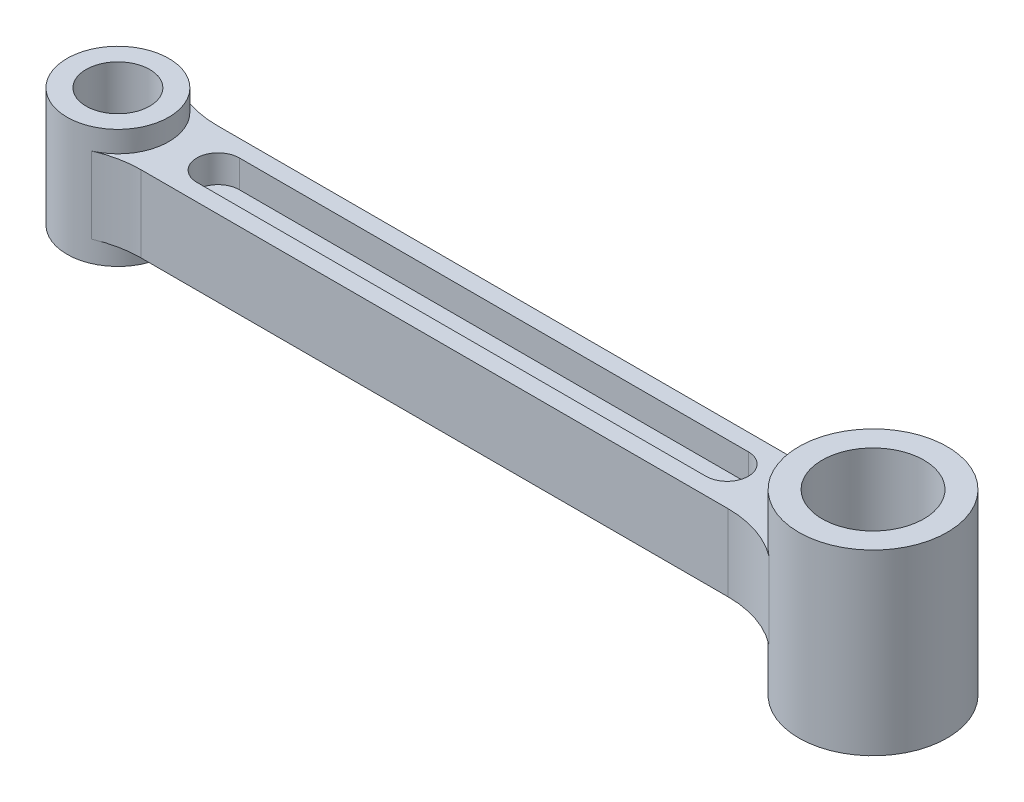
ISO-10303-21;
HEADER;
FILE_DESCRIPTION(('STEP AP214'),'2;1');
FILE_NAME('part.step','',(''),(''),'','','');
FILE_SCHEMA(('AUTOMOTIVE_DESIGN { 1 0 10303 214 1 1 1 1 }'));
ENDSEC;
DATA;
#1=APPLICATION_CONTEXT('core data for automotive mechanical design processes');
#2=APPLICATION_PROTOCOL_DEFINITION('international standard','automotive_design',2000,#1);
#3=PRODUCT_CONTEXT('',#1,'mechanical');
#4=PRODUCT('Part','Part','',(#3));
#5=PRODUCT_RELATED_PRODUCT_CATEGORY('part','',(#4));
#6=PRODUCT_DEFINITION_FORMATION('','',#4);
#7=PRODUCT_DEFINITION_CONTEXT('part definition',#1,'design');
#8=PRODUCT_DEFINITION('design','',#6,#7);
#9=PRODUCT_DEFINITION_SHAPE('','',#8);
#10=(LENGTH_UNIT() NAMED_UNIT(*) SI_UNIT(.MILLI.,.METRE.));
#11=(NAMED_UNIT(*) PLANE_ANGLE_UNIT() SI_UNIT($,.RADIAN.));
#12=(NAMED_UNIT(*) SI_UNIT($,.STERADIAN.) SOLID_ANGLE_UNIT());
#13=UNCERTAINTY_MEASURE_WITH_UNIT(LENGTH_MEASURE(1.E-05),#10,'distance_accuracy_value','');
#14=(GEOMETRIC_REPRESENTATION_CONTEXT(3) GLOBAL_UNCERTAINTY_ASSIGNED_CONTEXT((#13)) GLOBAL_UNIT_ASSIGNED_CONTEXT((#10,
#11,#12)) REPRESENTATION_CONTEXT('',''));
#15=CARTESIAN_POINT('',(0.,0.,0.));
#16=DIRECTION('',(0.,0.,1.));
#17=DIRECTION('',(1.,0.,0.));
#18=AXIS2_PLACEMENT_3D('',#15,#16,#17);
#19=CARTESIAN_POINT('',(143.611517752807,-2.5,0.));
#20=DIRECTION('',(0.,1.,0.));
#21=DIRECTION('',(0.,0.,1.));
#22=AXIS2_PLACEMENT_3D('',#19,#20,#21);
#23=CYLINDRICAL_SURFACE('',#22,5.);
#24=DIRECTION('',(0.,-1.,0.));
#25=VECTOR('',#24,1.);
#26=CARTESIAN_POINT('',(143.611517752807,-2.5,5.));
#27=LINE('',#26,#25);
#28=CARTESIAN_POINT('',(143.611517752807,-2.5,5.));
#29=VERTEX_POINT('',#28);
#30=CARTESIAN_POINT('',(143.611517752807,-9.,5.));
#31=VERTEX_POINT('',#30);
#32=EDGE_CURVE('E247',#29,#31,#27,.T.);
#33=ORIENTED_EDGE('',*,*,#32,.F.);
#34=CARTESIAN_POINT('',(143.611517752807,-2.5,0.));
#35=DIRECTION('',(0.,1.,0.));
#36=DIRECTION('',(0.,0.,1.));
#37=AXIS2_PLACEMENT_3D('',#34,#35,#36);
#38=CIRCLE('',#37,5.);
#39=CARTESIAN_POINT('',(143.611517752807,-2.5,-5.));
#40=VERTEX_POINT('',#39);
#41=EDGE_CURVE('E59',#40,#29,#38,.F.);
#42=ORIENTED_EDGE('',*,*,#41,.F.);
#43=DIRECTION('',(0.,-1.,0.));
#44=VECTOR('',#43,1.);
#45=CARTESIAN_POINT('',(143.611517752807,-2.5,-5.));
#46=LINE('',#45,#44);
#47=CARTESIAN_POINT('',(143.611517752807,-9.,-5.));
#48=VERTEX_POINT('',#47);
#49=EDGE_CURVE('E250',#48,#40,#46,.F.);
#50=ORIENTED_EDGE('',*,*,#49,.F.);
#51=CARTESIAN_POINT('',(143.611517752807,-9.,0.));
#52=DIRECTION('',(0.,1.,0.));
#53=DIRECTION('',(0.,0.,1.));
#54=AXIS2_PLACEMENT_3D('',#51,#52,#53);
#55=CIRCLE('',#54,5.);
#56=EDGE_CURVE('E12',#48,#31,#55,.F.);
#57=ORIENTED_EDGE('',*,*,#56,.T.);
#58=EDGE_LOOP('',(#33,#42,#50,#57));
#59=FACE_BOUND('',#58,.T.);
#60=ADVANCED_FACE('F51',(#59),#23,.F.);
#61=CARTESIAN_POINT('',(23.6115177528074,-9.,0.));
#62=DIRECTION('',(0.,1.,0.));
#63=DIRECTION('',(0.,0.,1.));
#64=AXIS2_PLACEMENT_3D('',#61,#62,#63);
#65=CYLINDRICAL_SURFACE('',#64,5.);
#66=DIRECTION('',(0.,-1.,0.));
#67=VECTOR('',#66,1.);
#68=CARTESIAN_POINT('',(23.6115177528074,-9.,5.));
#69=LINE('',#68,#67);
#70=CARTESIAN_POINT('',(23.6115177528074,-9.,5.));
#71=VERTEX_POINT('',#70);
#72=CARTESIAN_POINT('',(23.6115177528074,-2.5,5.));
#73=VERTEX_POINT('',#72);
#74=EDGE_CURVE('E235',#71,#73,#69,.F.);
#75=ORIENTED_EDGE('',*,*,#74,.F.);
#76=CARTESIAN_POINT('',(23.6115177528074,-9.,0.));
#77=DIRECTION('',(0.,1.,0.));
#78=DIRECTION('',(0.,0.,1.));
#79=AXIS2_PLACEMENT_3D('',#76,#77,#78);
#80=CIRCLE('',#79,5.);
#81=CARTESIAN_POINT('',(23.6115177528074,-9.,-5.));
#82=VERTEX_POINT('',#81);
#83=EDGE_CURVE('E244',#71,#82,#80,.F.);
#84=ORIENTED_EDGE('',*,*,#83,.T.);
#85=DIRECTION('',(0.,-1.,0.));
#86=VECTOR('',#85,1.);
#87=CARTESIAN_POINT('',(23.6115177528074,-9.,-5.));
#88=LINE('',#87,#86);
#89=CARTESIAN_POINT('',(23.6115177528074,-2.5,-5.));
#90=VERTEX_POINT('',#89);
#91=EDGE_CURVE('E238',#90,#82,#88,.T.);
#92=ORIENTED_EDGE('',*,*,#91,.F.);
#93=CARTESIAN_POINT('',(23.6115177528074,-2.5,0.));
#94=DIRECTION('',(0.,1.,0.));
#95=DIRECTION('',(0.,0.,1.));
#96=AXIS2_PLACEMENT_3D('',#93,#94,#95);
#97=CIRCLE('',#96,5.);
#98=EDGE_CURVE('E241',#73,#90,#97,.F.);
#99=ORIENTED_EDGE('',*,*,#98,.F.);
#100=EDGE_LOOP('',(#75,#84,#92,#99));
#101=FACE_BOUND('',#100,.T.);
#102=ADVANCED_FACE('F344',(#101),#65,.F.);
#103=CARTESIAN_POINT('',(143.611517752807,2.5,0.));
#104=DIRECTION('',(0.,-1.,0.));
#105=DIRECTION('',(0.,0.,-1.));
#106=AXIS2_PLACEMENT_3D('',#103,#104,#105);
#107=CYLINDRICAL_SURFACE('',#106,5.);
#108=DIRECTION('',(0.,1.,0.));
#109=VECTOR('',#108,1.);
#110=CARTESIAN_POINT('',(143.611517752807,2.5,-5.));
#111=LINE('',#110,#109);
#112=CARTESIAN_POINT('',(143.611517752807,2.5,-5.));
#113=VERTEX_POINT('',#112);
#114=CARTESIAN_POINT('',(143.611517752807,9.,-5.));
#115=VERTEX_POINT('',#114);
#116=EDGE_CURVE('E225',#113,#115,#111,.T.);
#117=ORIENTED_EDGE('',*,*,#116,.F.);
#118=CARTESIAN_POINT('',(143.611517752807,2.5,0.));
#119=DIRECTION('',(0.,-1.,0.));
#120=DIRECTION('',(0.,0.,-1.));
#121=AXIS2_PLACEMENT_3D('',#118,#119,#120);
#122=CIRCLE('',#121,5.);
#123=CARTESIAN_POINT('',(143.611517752807,2.5,5.));
#124=VERTEX_POINT('',#123);
#125=EDGE_CURVE('E231',#124,#113,#122,.F.);
#126=ORIENTED_EDGE('',*,*,#125,.F.);
#127=DIRECTION('',(0.,1.,0.));
#128=VECTOR('',#127,1.);
#129=CARTESIAN_POINT('',(143.611517752807,2.5,5.));
#130=LINE('',#129,#128);
#131=CARTESIAN_POINT('',(143.611517752807,9.,5.));
#132=VERTEX_POINT('',#131);
#133=EDGE_CURVE('E228',#132,#124,#130,.F.);
#134=ORIENTED_EDGE('',*,*,#133,.F.);
#135=CARTESIAN_POINT('',(143.611517752807,9.,0.));
#136=DIRECTION('',(0.,1.,0.));
#137=DIRECTION('',(0.,0.,1.));
#138=AXIS2_PLACEMENT_3D('',#135,#136,#137);
#139=CIRCLE('',#138,5.);
#140=EDGE_CURVE('E233',#132,#115,#139,.T.);
#141=ORIENTED_EDGE('',*,*,#140,.T.);
#142=EDGE_LOOP('',(#117,#126,#134,#141));
#143=FACE_BOUND('',#142,.T.);
#144=ADVANCED_FACE('F348',(#143),#107,.F.);
#145=CARTESIAN_POINT('',(23.6115177528074,9.,0.));
#146=DIRECTION('',(0.,-1.,0.));
#147=DIRECTION('',(0.,0.,-1.));
#148=AXIS2_PLACEMENT_3D('',#145,#146,#147);
#149=CYLINDRICAL_SURFACE('',#148,5.);
#150=DIRECTION('',(0.,1.,0.));
#151=VECTOR('',#150,1.);
#152=CARTESIAN_POINT('',(23.6115177528074,9.,-5.));
#153=LINE('',#152,#151);
#154=CARTESIAN_POINT('',(23.6115177528074,9.,-5.));
#155=VERTEX_POINT('',#154);
#156=CARTESIAN_POINT('',(23.6115177528074,2.5,-5.));
#157=VERTEX_POINT('',#156);
#158=EDGE_CURVE('E214',#155,#157,#153,.F.);
#159=ORIENTED_EDGE('',*,*,#158,.F.);
#160=CARTESIAN_POINT('',(23.6115177528074,9.,0.));
#161=DIRECTION('',(0.,1.,0.));
#162=DIRECTION('',(0.,0.,1.));
#163=AXIS2_PLACEMENT_3D('',#160,#161,#162);
#164=CIRCLE('',#163,5.);
#165=CARTESIAN_POINT('',(23.6115177528074,9.,5.));
#166=VERTEX_POINT('',#165);
#167=EDGE_CURVE('E222',#155,#166,#164,.T.);
#168=ORIENTED_EDGE('',*,*,#167,.T.);
#169=DIRECTION('',(0.,1.,0.));
#170=VECTOR('',#169,1.);
#171=CARTESIAN_POINT('',(23.6115177528074,9.,5.));
#172=LINE('',#171,#170);
#173=CARTESIAN_POINT('',(23.6115177528074,2.5,5.));
#174=VERTEX_POINT('',#173);
#175=EDGE_CURVE('E217',#174,#166,#172,.T.);
#176=ORIENTED_EDGE('',*,*,#175,.F.);
#177=CARTESIAN_POINT('',(23.6115177528074,2.5,0.));
#178=DIRECTION('',(0.,-1.,0.));
#179=DIRECTION('',(0.,0.,-1.));
#180=AXIS2_PLACEMENT_3D('',#177,#178,#179);
#181=CIRCLE('',#180,5.);
#182=EDGE_CURVE('E220',#157,#174,#181,.F.);
#183=ORIENTED_EDGE('',*,*,#182,.F.);
#184=EDGE_LOOP('',(#159,#168,#176,#183));
#185=FACE_BOUND('',#184,.T.);
#186=ADVANCED_FACE('F353',(#185),#149,.F.);
#187=CARTESIAN_POINT('',(178.,9.,0.));
#188=DIRECTION('',(0.,1.,0.));
#189=DIRECTION('',(0.,0.,1.));
#190=AXIS2_PLACEMENT_3D('',#187,#188,#189);
#191=PLANE('',#190);
#192=ORIENTED_EDGE('',*,*,#140,.F.);
#193=DIRECTION('',(-1.,0.,0.));
#194=VECTOR('',#193,1.);
#195=CARTESIAN_POINT('',(178.,9.,5.));
#196=LINE('',#195,#194);
#197=EDGE_CURVE('E209',#132,#166,#196,.T.);
#198=ORIENTED_EDGE('',*,*,#197,.T.);
#199=ORIENTED_EDGE('',*,*,#167,.F.);
#200=DIRECTION('',(1.,0.,0.));
#201=VECTOR('',#200,1.);
#202=CARTESIAN_POINT('',(178.,9.,-5.));
#203=LINE('',#202,#201);
#204=EDGE_CURVE('E211',#155,#115,#203,.T.);
#205=ORIENTED_EDGE('',*,*,#204,.T.);
#206=EDGE_LOOP('',(#192,#198,#199,#205));
#207=FACE_BOUND('',#206,.T.);
#208=CARTESIAN_POINT('',(178.,9.,0.));
#209=DIRECTION('',(0.,-1.,0.));
#210=DIRECTION('',(0.,0.,1.));
#211=AXIS2_PLACEMENT_3D('',#208,#209,#210);
#212=CIRCLE('',#211,17.5);
#213=CARTESIAN_POINT('',(167.388481117454,9.,13.9156626506024));
#214=VERTEX_POINT('',#213);
#215=CARTESIAN_POINT('',(167.388481117454,9.,-13.9156626506024));
#216=VERTEX_POINT('',#215);
#217=EDGE_CURVE('E160',#214,#216,#212,.T.);
#218=ORIENTED_EDGE('',*,*,#217,.T.);
#219=CARTESIAN_POINT('',(152.835540935677,9.,-33.));
#220=DIRECTION('',(0.,1.,0.));
#221=DIRECTION('',(0.,0.,1.));
#222=AXIS2_PLACEMENT_3D('',#219,#220,#221);
#223=CIRCLE('',#222,24.);
#224=CARTESIAN_POINT('',(152.835540935677,9.,-9.));
#225=VERTEX_POINT('',#224);
#226=EDGE_CURVE('E165',#216,#225,#223,.F.);
#227=ORIENTED_EDGE('',*,*,#226,.T.);
#228=DIRECTION('',(-1.,0.,0.));
#229=VECTOR('',#228,1.);
#230=CARTESIAN_POINT('',(7.93725393319378,9.,-9.));
#231=LINE('',#230,#229);
#232=CARTESIAN_POINT('',(14.3874945699382,9.,-9.));
#233=VERTEX_POINT('',#232);
#234=EDGE_CURVE('E173',#225,#233,#231,.T.);
#235=ORIENTED_EDGE('',*,*,#234,.T.);
#236=CARTESIAN_POINT('',(14.3874945699382,9.,-33.));
#237=DIRECTION('',(0.,1.,0.));
#238=DIRECTION('',(0.,0.,1.));
#239=AXIS2_PLACEMENT_3D('',#236,#237,#238);
#240=CIRCLE('',#239,24.);
#241=CARTESIAN_POINT('',(4.79583152331272,9.,-11.));
#242=VERTEX_POINT('',#241);
#243=EDGE_CURVE('E193',#233,#242,#240,.F.);
#244=ORIENTED_EDGE('',*,*,#243,.T.);
#245=CARTESIAN_POINT('',(0.,9.,0.));
#246=DIRECTION('',(0.,-1.,0.));
#247=DIRECTION('',(0.,0.,1.));
#248=AXIS2_PLACEMENT_3D('',#245,#246,#247);
#249=CIRCLE('',#248,12.);
#250=CARTESIAN_POINT('',(4.79583152331272,9.,11.));
#251=VERTEX_POINT('',#250);
#252=EDGE_CURVE('E280',#242,#251,#249,.T.);
#253=ORIENTED_EDGE('',*,*,#252,.T.);
#254=CARTESIAN_POINT('',(14.3874945699382,9.,33.));
#255=DIRECTION('',(0.,1.,0.));
#256=DIRECTION('',(0.,0.,1.));
#257=AXIS2_PLACEMENT_3D('',#254,#255,#256);
#258=CIRCLE('',#257,24.);
#259=CARTESIAN_POINT('',(14.3874945699382,9.,9.));
#260=VERTEX_POINT('',#259);
#261=EDGE_CURVE('E203',#251,#260,#258,.F.);
#262=ORIENTED_EDGE('',*,*,#261,.T.);
#263=DIRECTION('',(1.,0.,0.));
#264=VECTOR('',#263,1.);
#265=CARTESIAN_POINT('',(7.93725393319378,9.,9.));
#266=LINE('',#265,#264);
#267=CARTESIAN_POINT('',(152.835540935677,9.,9.));
#268=VERTEX_POINT('',#267);
#269=EDGE_CURVE('E282',#260,#268,#266,.T.);
#270=ORIENTED_EDGE('',*,*,#269,.T.);
#271=CARTESIAN_POINT('',(152.835540935677,9.,33.));
#272=DIRECTION('',(0.,1.,0.));
#273=DIRECTION('',(0.,0.,1.));
#274=AXIS2_PLACEMENT_3D('',#271,#272,#273);
#275=CIRCLE('',#274,24.);
#276=EDGE_CURVE('E169',#268,#214,#275,.F.);
#277=ORIENTED_EDGE('',*,*,#276,.T.);
#278=EDGE_LOOP('',(#218,#227,#235,#244,#253,#262,#270,#277));
#279=FACE_BOUND('',#278,.T.);
#280=ADVANCED_FACE('F162',(#207,#279),#191,.T.);
#281=CARTESIAN_POINT('',(178.,21.,0.));
#282=DIRECTION('',(0.,1.,0.));
#283=DIRECTION('',(0.,0.,1.));
#284=AXIS2_PLACEMENT_3D('',#281,#282,#283);
#285=PLANE('',#284);
#286=CARTESIAN_POINT('',(178.,21.,0.));
#287=DIRECTION('',(0.,1.,0.));
#288=DIRECTION('',(0.,0.,1.));
#289=AXIS2_PLACEMENT_3D('',#286,#287,#288);
#290=CIRCLE('',#289,17.5);
#291=CARTESIAN_POINT('',(178.,21.,17.5));
#292=VERTEX_POINT('',#291);
#293=EDGE_CURVE('E184',#292,#292,#290,.T.);
#294=ORIENTED_EDGE('',*,*,#293,.T.);
#295=EDGE_LOOP('',(#294));
#296=FACE_BOUND('',#295,.T.);
#297=CARTESIAN_POINT('',(178.,21.,0.));
#298=DIRECTION('',(0.,1.,0.));
#299=DIRECTION('',(0.,0.,1.));
#300=AXIS2_PLACEMENT_3D('',#297,#298,#299);
#301=CIRCLE('',#300,12.);
#302=CARTESIAN_POINT('',(178.,21.,-12.));
#303=VERTEX_POINT('',#302);
#304=EDGE_CURVE('E293',#303,#303,#301,.T.);
#305=ORIENTED_EDGE('',*,*,#304,.F.);
#306=EDGE_LOOP('',(#305));
#307=FACE_BOUND('',#306,.T.);
#308=ADVANCED_FACE('F409',(#296,#307),#285,.T.);
#309=CARTESIAN_POINT('',(178.,-21.,0.));
#310=DIRECTION('',(0.,1.,0.));
#311=DIRECTION('',(0.,0.,1.));
#312=AXIS2_PLACEMENT_3D('',#309,#310,#311);
#313=PLANE('',#312);
#314=CARTESIAN_POINT('',(178.,-21.,0.));
#315=DIRECTION('',(0.,1.,0.));
#316=DIRECTION('',(0.,0.,1.));
#317=AXIS2_PLACEMENT_3D('',#314,#315,#316);
#318=CIRCLE('',#317,17.5);
#319=CARTESIAN_POINT('',(178.,-21.,17.5));
#320=VERTEX_POINT('',#319);
#321=EDGE_CURVE('E296',#320,#320,#318,.T.);
#322=ORIENTED_EDGE('',*,*,#321,.F.);
#323=EDGE_LOOP('',(#322));
#324=FACE_BOUND('',#323,.T.);
#325=CARTESIAN_POINT('',(178.,-21.,0.));
#326=DIRECTION('',(0.,1.,0.));
#327=DIRECTION('',(0.,0.,1.));
#328=AXIS2_PLACEMENT_3D('',#325,#326,#327);
#329=CIRCLE('',#328,12.);
#330=CARTESIAN_POINT('',(178.,-21.,-12.));
#331=VERTEX_POINT('',#330);
#332=EDGE_CURVE('E284',#331,#331,#329,.T.);
#333=ORIENTED_EDGE('',*,*,#332,.T.);
#334=EDGE_LOOP('',(#333));
#335=FACE_BOUND('',#334,.T.);
#336=ADVANCED_FACE('F423',(#324,#335),#313,.F.);
#337=CARTESIAN_POINT('',(178.,21.,0.));
#338=DIRECTION('',(0.,-1.,0.));
#339=DIRECTION('',(0.,0.,-1.));
#340=AXIS2_PLACEMENT_3D('',#337,#338,#339);
#341=CYLINDRICAL_SURFACE('',#340,17.5);
#342=DIRECTION('',(0.,-1.,0.));
#343=VECTOR('',#342,1.);
#344=CARTESIAN_POINT('',(167.388481117454,21.,13.9156626506024));
#345=LINE('',#344,#343);
#346=CARTESIAN_POINT('',(167.388481117454,-9.,13.9156626506024));
#347=VERTEX_POINT('',#346);
#348=EDGE_CURVE('E183',#214,#347,#345,.T.);
#349=ORIENTED_EDGE('',*,*,#348,.T.);
#350=CARTESIAN_POINT('',(178.,-9.,0.));
#351=DIRECTION('',(0.,-1.,0.));
#352=DIRECTION('',(0.,0.,1.));
#353=AXIS2_PLACEMENT_3D('',#350,#351,#352);
#354=CIRCLE('',#353,17.5);
#355=CARTESIAN_POINT('',(167.388481117454,-9.,-13.9156626506024));
#356=VERTEX_POINT('',#355);
#357=EDGE_CURVE('E180',#347,#356,#354,.T.);
#358=ORIENTED_EDGE('',*,*,#357,.T.);
#359=DIRECTION('',(0.,-1.,0.));
#360=VECTOR('',#359,1.);
#361=CARTESIAN_POINT('',(167.388481117454,21.,-13.9156626506024));
#362=LINE('',#361,#360);
#363=EDGE_CURVE('E177',#356,#216,#362,.F.);
#364=ORIENTED_EDGE('',*,*,#363,.T.);
#365=ORIENTED_EDGE('',*,*,#217,.F.);
#366=EDGE_LOOP('',(#349,#358,#364,#365));
#367=FACE_BOUND('',#366,.T.);
#368=ORIENTED_EDGE('',*,*,#293,.F.);
#369=EDGE_LOOP('',(#368));
#370=FACE_BOUND('',#369,.T.);
#371=ORIENTED_EDGE('',*,*,#321,.T.);
#372=EDGE_LOOP('',(#371));
#373=FACE_BOUND('',#372,.T.);
#374=ADVANCED_FACE('F178',(#367,#370,#373),#341,.T.);
#375=CARTESIAN_POINT('',(178.,21.,0.));
#376=DIRECTION('',(0.,-1.,0.));
#377=DIRECTION('',(0.,0.,-1.));
#378=AXIS2_PLACEMENT_3D('',#375,#376,#377);
#379=CYLINDRICAL_SURFACE('',#378,12.);
#380=CARTESIAN_POINT('',(178.,21.,-12.));
#381=CARTESIAN_POINT('',(178.,20.5625,-12.));
#382=CARTESIAN_POINT('',(178.,20.125,-12.));
#383=CARTESIAN_POINT('',(178.,19.25,-12.));
#384=CARTESIAN_POINT('',(178.,18.8125,-12.));
#385=CARTESIAN_POINT('',(178.,17.9375,-12.));
#386=CARTESIAN_POINT('',(178.,17.5,-12.));
#387=CARTESIAN_POINT('',(178.,16.625,-12.));
#388=CARTESIAN_POINT('',(178.,16.1875,-12.));
#389=CARTESIAN_POINT('',(178.,15.3125,-12.));
#390=CARTESIAN_POINT('',(178.,14.875,-12.));
#391=CARTESIAN_POINT('',(178.,14.,-12.));
#392=CARTESIAN_POINT('',(178.,13.5625,-12.));
#393=CARTESIAN_POINT('',(178.,12.6875,-12.));
#394=CARTESIAN_POINT('',(178.,12.25,-12.));
#395=CARTESIAN_POINT('',(178.,11.375,-12.));
#396=CARTESIAN_POINT('',(178.,10.9375,-12.));
#397=CARTESIAN_POINT('',(178.,10.0625,-12.));
#398=CARTESIAN_POINT('',(178.,9.625,-12.));
#399=CARTESIAN_POINT('',(178.,8.75,-12.));
#400=CARTESIAN_POINT('',(178.,8.3125,-12.));
#401=CARTESIAN_POINT('',(178.,7.4375,-12.));
#402=CARTESIAN_POINT('',(178.,7.,-12.));
#403=CARTESIAN_POINT('',(178.,6.125,-12.));
#404=CARTESIAN_POINT('',(178.,5.6875,-12.));
#405=CARTESIAN_POINT('',(178.,4.8125,-12.));
#406=CARTESIAN_POINT('',(178.,4.375,-12.));
#407=CARTESIAN_POINT('',(178.,3.5,-12.));
#408=CARTESIAN_POINT('',(178.,3.0625,-12.));
#409=CARTESIAN_POINT('',(178.,2.1875,-12.));
#410=CARTESIAN_POINT('',(178.,1.75,-12.));
#411=CARTESIAN_POINT('',(178.,0.874999999999997,-12.));
#412=CARTESIAN_POINT('',(178.,0.437499999999997,-12.));
#413=CARTESIAN_POINT('',(178.,-0.437500000000004,-12.));
#414=CARTESIAN_POINT('',(178.,-0.875000000000004,-12.));
#415=CARTESIAN_POINT('',(178.,-1.75000000000001,-12.));
#416=CARTESIAN_POINT('',(178.,-2.18750000000001,-12.));
#417=CARTESIAN_POINT('',(178.,-3.0625,-12.));
#418=CARTESIAN_POINT('',(178.,-3.5,-12.));
#419=CARTESIAN_POINT('',(178.,-4.375,-12.));
#420=CARTESIAN_POINT('',(178.,-4.8125,-12.));
#421=CARTESIAN_POINT('',(178.,-5.68750000000001,-12.));
#422=CARTESIAN_POINT('',(178.,-6.12500000000001,-12.));
#423=CARTESIAN_POINT('',(178.,-7.00000000000001,-12.));
#424=CARTESIAN_POINT('',(178.,-7.4375,-12.));
#425=CARTESIAN_POINT('',(178.,-8.3125,-12.));
#426=CARTESIAN_POINT('',(178.,-8.75,-12.));
#427=CARTESIAN_POINT('',(178.,-9.625,-12.));
#428=CARTESIAN_POINT('',(178.,-10.0625,-12.));
#429=CARTESIAN_POINT('',(178.,-10.9375,-12.));
#430=CARTESIAN_POINT('',(178.,-11.375,-12.));
#431=CARTESIAN_POINT('',(178.,-12.25,-12.));
#432=CARTESIAN_POINT('',(178.,-12.6875,-12.));
#433=CARTESIAN_POINT('',(178.,-13.5625,-12.));
#434=CARTESIAN_POINT('',(178.,-14.,-12.));
#435=CARTESIAN_POINT('',(178.,-14.875,-12.));
#436=CARTESIAN_POINT('',(178.,-15.3125,-12.));
#437=CARTESIAN_POINT('',(178.,-16.1875,-12.));
#438=CARTESIAN_POINT('',(178.,-16.625,-12.));
#439=CARTESIAN_POINT('',(178.,-17.5,-12.));
#440=CARTESIAN_POINT('',(178.,-17.9375,-12.));
#441=CARTESIAN_POINT('',(178.,-18.8125,-12.));
#442=CARTESIAN_POINT('',(178.,-19.25,-12.));
#443=CARTESIAN_POINT('',(178.,-20.125,-12.));
#444=CARTESIAN_POINT('',(178.,-20.5625,-12.));
#445=CARTESIAN_POINT('',(178.,-21.,-12.));
#446=B_SPLINE_CURVE_WITH_KNOTS('',3,(#380,#381,#382,#383,#384,#385,#386,#387,#388,#389,#390,
#391,#392,#393,#394,#395,#396,#397,#398,#399,#400,#401,#402,#403,#404,#405,#406,#407,#408,#409,
#410,#411,#412,#413,#414,#415,#416,#417,#418,#419,#420,#421,#422,#423,#424,#425,#426,#427,#428,
#429,#430,#431,#432,#433,#434,#435,#436,#437,#438,#439,#440,#441,#442,#443,#444,#445),
.UNSPECIFIED.,.F.,.F.,(4,2,2,2,2,2,2,2,2,2,2,2,2,2,2,2,2,2,2,2,2,2,2,2,2,2,2,2,2,2,2,2,4),(0.,
1.3125,2.625,3.9375,5.25,6.5625,7.875,9.1875,10.5,11.8125,13.125,14.4375,15.75,17.0625,18.375,
19.6875,21.,22.3125,23.625,24.9375,26.25,27.5625,28.875,30.1875,31.5,32.8125,34.125,35.4375,
36.75,38.0625,39.375,40.6875,42.),.UNSPECIFIED.);
#447=EDGE_CURVE('BSEAM417',#303,#331,#446,.T.);
#448=ORIENTED_EDGE('',*,*,#304,.T.);
#449=ORIENTED_EDGE('',*,*,#332,.F.);
#450=ORIENTED_EDGE('',*,*,#447,.T.);
#451=ORIENTED_EDGE('',*,*,#447,.F.);
#452=EDGE_LOOP('',(#448,#450,#449,#451));
#453=FACE_BOUND('',#452,.T.);
#454=ADVANCED_FACE('F417',(#453),#379,.F.);
#455=CARTESIAN_POINT('',(7.93725393319378,9.,-9.));
#456=DIRECTION('',(0.,0.,1.));
#457=DIRECTION('',(1.,0.,0.));
#458=AXIS2_PLACEMENT_3D('',#455,#456,#457);
#459=PLANE('',#458);
#460=ORIENTED_EDGE('',*,*,#234,.F.);
#461=DIRECTION('',(0.,1.,0.));
#462=VECTOR('',#461,1.);
#463=CARTESIAN_POINT('',(152.835540935677,-8.99999999999999,-9.));
#464=LINE('',#463,#462);
#465=CARTESIAN_POINT('',(152.835540935677,-9.,-9.));
#466=VERTEX_POINT('',#465);
#467=EDGE_CURVE('E189',#225,#466,#464,.F.);
#468=ORIENTED_EDGE('',*,*,#467,.T.);
#469=DIRECTION('',(-1.,0.,0.));
#470=VECTOR('',#469,1.);
#471=CARTESIAN_POINT('',(7.93725393319378,-9.,-9.));
#472=LINE('',#471,#470);
#473=CARTESIAN_POINT('',(14.3874945699382,-9.,-9.));
#474=VERTEX_POINT('',#473);
#475=EDGE_CURVE('E286',#466,#474,#472,.T.);
#476=ORIENTED_EDGE('',*,*,#475,.T.);
#477=DIRECTION('',(0.,1.,0.));
#478=VECTOR('',#477,1.);
#479=CARTESIAN_POINT('',(14.3874945699382,9.,-9.));
#480=LINE('',#479,#478);
#481=EDGE_CURVE('E309',#474,#233,#480,.T.);
#482=ORIENTED_EDGE('',*,*,#481,.T.);
#483=EDGE_LOOP('',(#460,#468,#476,#482));
#484=FACE_BOUND('',#483,.T.);
#485=ADVANCED_FACE('F382',(#484),#459,.F.);
#486=CARTESIAN_POINT('',(7.93725393319378,9.,9.));
#487=DIRECTION('',(0.,0.,-1.));
#488=DIRECTION('',(-1.,0.,0.));
#489=AXIS2_PLACEMENT_3D('',#486,#487,#488);
#490=PLANE('',#489);
#491=DIRECTION('',(1.,0.,0.));
#492=VECTOR('',#491,1.);
#493=CARTESIAN_POINT('',(7.93725393319378,-9.,9.));
#494=LINE('',#493,#492);
#495=CARTESIAN_POINT('',(14.3874945699382,-9.,9.));
#496=VERTEX_POINT('',#495);
#497=CARTESIAN_POINT('',(152.835540935677,-9.,9.));
#498=VERTEX_POINT('',#497);
#499=EDGE_CURVE('E174',#496,#498,#494,.T.);
#500=ORIENTED_EDGE('',*,*,#499,.T.);
#501=DIRECTION('',(0.,1.,0.));
#502=VECTOR('',#501,1.);
#503=CARTESIAN_POINT('',(152.835540935677,9.,9.));
#504=LINE('',#503,#502);
#505=EDGE_CURVE('E307',#498,#268,#504,.T.);
#506=ORIENTED_EDGE('',*,*,#505,.T.);
#507=ORIENTED_EDGE('',*,*,#269,.F.);
#508=DIRECTION('',(0.,1.,0.));
#509=VECTOR('',#508,1.);
#510=CARTESIAN_POINT('',(14.3874945699382,-9.,9.));
#511=LINE('',#510,#509);
#512=EDGE_CURVE('E304',#260,#496,#511,.F.);
#513=ORIENTED_EDGE('',*,*,#512,.T.);
#514=EDGE_LOOP('',(#500,#506,#507,#513));
#515=FACE_BOUND('',#514,.T.);
#516=ADVANCED_FACE('F326',(#515),#490,.F.);
#517=CARTESIAN_POINT('',(178.,-9.,0.));
#518=DIRECTION('',(0.,1.,0.));
#519=DIRECTION('',(0.,0.,1.));
#520=AXIS2_PLACEMENT_3D('',#517,#518,#519);
#521=PLANE('',#520);
#522=ORIENTED_EDGE('',*,*,#56,.F.);
#523=DIRECTION('',(-1.,0.,0.));
#524=VECTOR('',#523,1.);
#525=CARTESIAN_POINT('',(178.,-9.,-5.));
#526=LINE('',#525,#524);
#527=EDGE_CURVE('E205',#48,#82,#526,.T.);
#528=ORIENTED_EDGE('',*,*,#527,.T.);
#529=ORIENTED_EDGE('',*,*,#83,.F.);
#530=DIRECTION('',(1.,0.,0.));
#531=VECTOR('',#530,1.);
#532=CARTESIAN_POINT('',(178.,-9.,5.));
#533=LINE('',#532,#531);
#534=EDGE_CURVE('E207',#71,#31,#533,.T.);
#535=ORIENTED_EDGE('',*,*,#534,.T.);
#536=EDGE_LOOP('',(#522,#528,#529,#535));
#537=FACE_BOUND('',#536,.T.);
#538=ORIENTED_EDGE('',*,*,#357,.F.);
#539=CARTESIAN_POINT('',(152.835540935677,-9.,33.));
#540=DIRECTION('',(0.,1.,0.));
#541=DIRECTION('',(0.,0.,1.));
#542=AXIS2_PLACEMENT_3D('',#539,#540,#541);
#543=CIRCLE('',#542,24.);
#544=EDGE_CURVE('E318',#347,#498,#543,.T.);
#545=ORIENTED_EDGE('',*,*,#544,.T.);
#546=ORIENTED_EDGE('',*,*,#499,.F.);
#547=CARTESIAN_POINT('',(14.3874945699382,-9.,33.));
#548=DIRECTION('',(0.,1.,0.));
#549=DIRECTION('',(0.,0.,1.));
#550=AXIS2_PLACEMENT_3D('',#547,#548,#549);
#551=CIRCLE('',#550,24.);
#552=CARTESIAN_POINT('',(4.79583152331272,-9.,11.));
#553=VERTEX_POINT('',#552);
#554=EDGE_CURVE('E200',#496,#553,#551,.T.);
#555=ORIENTED_EDGE('',*,*,#554,.T.);
#556=CARTESIAN_POINT('',(0.,-9.,0.));
#557=DIRECTION('',(0.,-1.,0.));
#558=DIRECTION('',(0.,0.,1.));
#559=AXIS2_PLACEMENT_3D('',#556,#557,#558);
#560=CIRCLE('',#559,12.);
#561=CARTESIAN_POINT('',(4.79583152331272,-9.,-11.));
#562=VERTEX_POINT('',#561);
#563=EDGE_CURVE('E289',#562,#553,#560,.T.);
#564=ORIENTED_EDGE('',*,*,#563,.F.);
#565=CARTESIAN_POINT('',(14.3874945699382,-9.,-33.));
#566=DIRECTION('',(0.,1.,0.));
#567=DIRECTION('',(0.,0.,1.));
#568=AXIS2_PLACEMENT_3D('',#565,#566,#567);
#569=CIRCLE('',#568,24.);
#570=EDGE_CURVE('E190',#562,#474,#569,.T.);
#571=ORIENTED_EDGE('',*,*,#570,.T.);
#572=ORIENTED_EDGE('',*,*,#475,.F.);
#573=CARTESIAN_POINT('',(152.835540935677,-9.,-33.));
#574=DIRECTION('',(0.,1.,0.));
#575=DIRECTION('',(0.,0.,1.));
#576=AXIS2_PLACEMENT_3D('',#573,#574,#575);
#577=CIRCLE('',#576,24.);
#578=EDGE_CURVE('E191',#466,#356,#577,.T.);
#579=ORIENTED_EDGE('',*,*,#578,.T.);
#580=EDGE_LOOP('',(#538,#545,#546,#555,#564,#571,#572,#579));
#581=FACE_BOUND('',#580,.T.);
#582=ADVANCED_FACE('F322',(#537,#581),#521,.F.);
#583=CARTESIAN_POINT('',(0.,14.,0.));
#584=DIRECTION('',(0.,1.,0.));
#585=DIRECTION('',(0.,0.,1.));
#586=AXIS2_PLACEMENT_3D('',#583,#584,#585);
#587=PLANE('',#586);
#588=CARTESIAN_POINT('',(0.,14.,0.));
#589=DIRECTION('',(0.,1.,0.));
#590=DIRECTION('',(0.,0.,1.));
#591=AXIS2_PLACEMENT_3D('',#588,#589,#590);
#592=CIRCLE('',#591,12.);
#593=CARTESIAN_POINT('',(0.,14.,12.));
#594=VERTEX_POINT('',#593);
#595=EDGE_CURVE('E274',#594,#594,#592,.T.);
#596=ORIENTED_EDGE('',*,*,#595,.T.);
#597=EDGE_LOOP('',(#596));
#598=FACE_BOUND('',#597,.T.);
#599=CARTESIAN_POINT('',(0.,14.,0.));
#600=DIRECTION('',(0.,1.,0.));
#601=DIRECTION('',(0.,0.,1.));
#602=AXIS2_PLACEMENT_3D('',#599,#600,#601);
#603=CIRCLE('',#602,7.5);
#604=CARTESIAN_POINT('',(0.,14.,7.5));
#605=VERTEX_POINT('',#604);
#606=EDGE_CURVE('E265',#605,#605,#603,.T.);
#607=ORIENTED_EDGE('',*,*,#606,.F.);
#608=EDGE_LOOP('',(#607));
#609=FACE_BOUND('',#608,.T.);
#610=ADVANCED_FACE('F397',(#598,#609),#587,.T.);
#611=CARTESIAN_POINT('',(0.,-14.,0.));
#612=DIRECTION('',(0.,1.,0.));
#613=DIRECTION('',(0.,0.,1.));
#614=AXIS2_PLACEMENT_3D('',#611,#612,#613);
#615=PLANE('',#614);
#616=CARTESIAN_POINT('',(0.,-14.,0.));
#617=DIRECTION('',(0.,1.,0.));
#618=DIRECTION('',(0.,0.,1.));
#619=AXIS2_PLACEMENT_3D('',#616,#617,#618);
#620=CIRCLE('',#619,12.);
#621=CARTESIAN_POINT('',(0.,-14.,12.));
#622=VERTEX_POINT('',#621);
#623=EDGE_CURVE('E272',#622,#622,#620,.T.);
#624=ORIENTED_EDGE('',*,*,#623,.F.);
#625=EDGE_LOOP('',(#624));
#626=FACE_BOUND('',#625,.T.);
#627=CARTESIAN_POINT('',(0.,-14.,0.));
#628=DIRECTION('',(0.,1.,0.));
#629=DIRECTION('',(0.,0.,1.));
#630=AXIS2_PLACEMENT_3D('',#627,#628,#629);
#631=CIRCLE('',#630,7.5);
#632=CARTESIAN_POINT('',(0.,-14.,7.5));
#633=VERTEX_POINT('',#632);
#634=EDGE_CURVE('E262',#633,#633,#631,.T.);
#635=ORIENTED_EDGE('',*,*,#634,.T.);
#636=EDGE_LOOP('',(#635));
#637=FACE_BOUND('',#636,.T.);
#638=ADVANCED_FACE('F389',(#626,#637),#615,.F.);
#639=CARTESIAN_POINT('',(0.,14.,0.));
#640=DIRECTION('',(0.,-1.,0.));
#641=DIRECTION('',(0.,0.,-1.));
#642=AXIS2_PLACEMENT_3D('',#639,#640,#641);
#643=CYLINDRICAL_SURFACE('',#642,12.);
#644=DIRECTION('',(0.,-1.,0.));
#645=VECTOR('',#644,1.);
#646=CARTESIAN_POINT('',(4.79583152331272,14.,-11.));
#647=LINE('',#646,#645);
#648=EDGE_CURVE('E315',#242,#562,#647,.T.);
#649=ORIENTED_EDGE('',*,*,#648,.T.);
#650=ORIENTED_EDGE('',*,*,#563,.T.);
#651=DIRECTION('',(0.,-1.,0.));
#652=VECTOR('',#651,1.);
#653=CARTESIAN_POINT('',(4.79583152331272,14.,11.));
#654=LINE('',#653,#652);
#655=EDGE_CURVE('E312',#553,#251,#654,.F.);
#656=ORIENTED_EDGE('',*,*,#655,.T.);
#657=ORIENTED_EDGE('',*,*,#252,.F.);
#658=EDGE_LOOP('',(#649,#650,#656,#657));
#659=FACE_BOUND('',#658,.T.);
#660=ORIENTED_EDGE('',*,*,#595,.F.);
#661=EDGE_LOOP('',(#660));
#662=FACE_BOUND('',#661,.T.);
#663=ORIENTED_EDGE('',*,*,#623,.T.);
#664=EDGE_LOOP('',(#663));
#665=FACE_BOUND('',#664,.T.);
#666=ADVANCED_FACE('F339',(#659,#662,#665),#643,.T.);
#667=CARTESIAN_POINT('',(0.,14.,0.));
#668=DIRECTION('',(0.,-1.,0.));
#669=DIRECTION('',(0.,0.,-1.));
#670=AXIS2_PLACEMENT_3D('',#667,#668,#669);
#671=CYLINDRICAL_SURFACE('',#670,7.5);
#672=ORIENTED_EDGE('',*,*,#606,.T.);
#673=EDGE_LOOP('',(#672));
#674=FACE_BOUND('',#673,.T.);
#675=ORIENTED_EDGE('',*,*,#634,.F.);
#676=EDGE_LOOP('',(#675));
#677=FACE_BOUND('',#676,.T.);
#678=ADVANCED_FACE('F331',(#674,#677),#671,.F.);
#679=CARTESIAN_POINT('',(152.835540935677,21.,33.));
#680=DIRECTION('',(0.,-1.,0.));
#681=DIRECTION('',(0.,0.,-1.));
#682=AXIS2_PLACEMENT_3D('',#679,#680,#681);
#683=CYLINDRICAL_SURFACE('',#682,24.);
#684=ORIENTED_EDGE('',*,*,#276,.F.);
#685=ORIENTED_EDGE('',*,*,#505,.F.);
#686=ORIENTED_EDGE('',*,*,#544,.F.);
#687=ORIENTED_EDGE('',*,*,#348,.F.);
#688=EDGE_LOOP('',(#684,#685,#686,#687));
#689=FACE_BOUND('',#688,.T.);
#690=ADVANCED_FACE('F329',(#689),#683,.F.);
#691=CARTESIAN_POINT('',(152.835540935677,21.,-33.));
#692=DIRECTION('',(0.,-1.,0.));
#693=DIRECTION('',(0.,0.,-1.));
#694=AXIS2_PLACEMENT_3D('',#691,#692,#693);
#695=CYLINDRICAL_SURFACE('',#694,24.);
#696=ORIENTED_EDGE('',*,*,#226,.F.);
#697=ORIENTED_EDGE('',*,*,#363,.F.);
#698=ORIENTED_EDGE('',*,*,#578,.F.);
#699=ORIENTED_EDGE('',*,*,#467,.F.);
#700=EDGE_LOOP('',(#696,#697,#698,#699));
#701=FACE_BOUND('',#700,.T.);
#702=ADVANCED_FACE('F187',(#701),#695,.F.);
#703=CARTESIAN_POINT('',(14.3874945699382,14.,-33.));
#704=DIRECTION('',(0.,-1.,0.));
#705=DIRECTION('',(0.,0.,-1.));
#706=AXIS2_PLACEMENT_3D('',#703,#704,#705);
#707=CYLINDRICAL_SURFACE('',#706,24.);
#708=ORIENTED_EDGE('',*,*,#243,.F.);
#709=ORIENTED_EDGE('',*,*,#481,.F.);
#710=ORIENTED_EDGE('',*,*,#570,.F.);
#711=ORIENTED_EDGE('',*,*,#648,.F.);
#712=EDGE_LOOP('',(#708,#709,#710,#711));
#713=FACE_BOUND('',#712,.T.);
#714=ADVANCED_FACE('F337',(#713),#707,.F.);
#715=CARTESIAN_POINT('',(14.3874945699382,14.,33.));
#716=DIRECTION('',(0.,-1.,0.));
#717=DIRECTION('',(0.,0.,-1.));
#718=AXIS2_PLACEMENT_3D('',#715,#716,#717);
#719=CYLINDRICAL_SURFACE('',#718,24.);
#720=ORIENTED_EDGE('',*,*,#261,.F.);
#721=ORIENTED_EDGE('',*,*,#655,.F.);
#722=ORIENTED_EDGE('',*,*,#554,.F.);
#723=ORIENTED_EDGE('',*,*,#512,.F.);
#724=EDGE_LOOP('',(#720,#721,#722,#723));
#725=FACE_BOUND('',#724,.T.);
#726=ADVANCED_FACE('F369',(#725),#719,.F.);
#727=CARTESIAN_POINT('',(18.6115177528074,-20.5,5.));
#728=DIRECTION('',(0.,0.,1.));
#729=DIRECTION('',(1.,0.,0.));
#730=AXIS2_PLACEMENT_3D('',#727,#728,#729);
#731=PLANE('',#730);
#732=DIRECTION('',(1.,0.,0.));
#733=VECTOR('',#732,1.);
#734=CARTESIAN_POINT('',(18.6115177528074,-2.5,5.));
#735=LINE('',#734,#733);
#736=EDGE_CURVE('E256',#73,#29,#735,.T.);
#737=ORIENTED_EDGE('',*,*,#736,.T.);
#738=ORIENTED_EDGE('',*,*,#32,.T.);
#739=ORIENTED_EDGE('',*,*,#534,.F.);
#740=ORIENTED_EDGE('',*,*,#74,.T.);
#741=EDGE_LOOP('',(#737,#738,#739,#740));
#742=FACE_BOUND('',#741,.T.);
#743=ADVANCED_FACE('F260',(#742),#731,.F.);
#744=CARTESIAN_POINT('',(18.6115177528074,-20.5,-5.));
#745=DIRECTION('',(0.,0.,-1.));
#746=DIRECTION('',(-1.,0.,0.));
#747=AXIS2_PLACEMENT_3D('',#744,#745,#746);
#748=PLANE('',#747);
#749=ORIENTED_EDGE('',*,*,#527,.F.);
#750=ORIENTED_EDGE('',*,*,#49,.T.);
#751=DIRECTION('',(-1.,0.,0.));
#752=VECTOR('',#751,1.);
#753=CARTESIAN_POINT('',(18.6115177528074,-2.5,-5.));
#754=LINE('',#753,#752);
#755=EDGE_CURVE('E257',#40,#90,#754,.T.);
#756=ORIENTED_EDGE('',*,*,#755,.T.);
#757=ORIENTED_EDGE('',*,*,#91,.T.);
#758=EDGE_LOOP('',(#749,#750,#756,#757));
#759=FACE_BOUND('',#758,.T.);
#760=ADVANCED_FACE('F568',(#759),#748,.F.);
#761=CARTESIAN_POINT('',(0.,-2.5,0.));
#762=DIRECTION('',(0.,1.,0.));
#763=DIRECTION('',(0.,0.,1.));
#764=AXIS2_PLACEMENT_3D('',#761,#762,#763);
#765=PLANE('',#764);
#766=ORIENTED_EDGE('',*,*,#755,.F.);
#767=ORIENTED_EDGE('',*,*,#41,.T.);
#768=ORIENTED_EDGE('',*,*,#736,.F.);
#769=ORIENTED_EDGE('',*,*,#98,.T.);
#770=EDGE_LOOP('',(#766,#767,#768,#769));
#771=FACE_BOUND('',#770,.T.);
#772=ADVANCED_FACE('F254',(#771),#765,.F.);
#773=CARTESIAN_POINT('',(18.6115177528074,20.5,-5.));
#774=DIRECTION('',(0.,0.,1.));
#775=DIRECTION('',(1.,0.,0.));
#776=AXIS2_PLACEMENT_3D('',#773,#774,#775);
#777=PLANE('',#776);
#778=DIRECTION('',(-1.,0.,0.));
#779=VECTOR('',#778,1.);
#780=CARTESIAN_POINT('',(18.6115177528074,2.5,-5.));
#781=LINE('',#780,#779);
#782=EDGE_CURVE('E267',#113,#157,#781,.T.);
#783=ORIENTED_EDGE('',*,*,#782,.F.);
#784=ORIENTED_EDGE('',*,*,#116,.T.);
#785=ORIENTED_EDGE('',*,*,#204,.F.);
#786=ORIENTED_EDGE('',*,*,#158,.T.);
#787=EDGE_LOOP('',(#783,#784,#785,#786));
#788=FACE_BOUND('',#787,.T.);
#789=ADVANCED_FACE('F524',(#788),#777,.T.);
#790=CARTESIAN_POINT('',(18.6115177528074,20.5,5.));
#791=DIRECTION('',(0.,0.,-1.));
#792=DIRECTION('',(-1.,0.,0.));
#793=AXIS2_PLACEMENT_3D('',#790,#791,#792);
#794=PLANE('',#793);
#795=ORIENTED_EDGE('',*,*,#197,.F.);
#796=ORIENTED_EDGE('',*,*,#133,.T.);
#797=DIRECTION('',(1.,0.,0.));
#798=VECTOR('',#797,1.);
#799=CARTESIAN_POINT('',(18.6115177528074,2.5,5.));
#800=LINE('',#799,#798);
#801=EDGE_CURVE('E642',#174,#124,#800,.T.);
#802=ORIENTED_EDGE('',*,*,#801,.F.);
#803=ORIENTED_EDGE('',*,*,#175,.T.);
#804=EDGE_LOOP('',(#795,#796,#802,#803));
#805=FACE_BOUND('',#804,.T.);
#806=ADVANCED_FACE('F529',(#805),#794,.T.);
#807=CARTESIAN_POINT('',(0.,2.5,0.));
#808=DIRECTION('',(0.,-1.,0.));
#809=DIRECTION('',(0.,0.,1.));
#810=AXIS2_PLACEMENT_3D('',#807,#808,#809);
#811=PLANE('',#810);
#812=ORIENTED_EDGE('',*,*,#801,.T.);
#813=ORIENTED_EDGE('',*,*,#125,.T.);
#814=ORIENTED_EDGE('',*,*,#782,.T.);
#815=ORIENTED_EDGE('',*,*,#182,.T.);
#816=EDGE_LOOP('',(#812,#813,#814,#815));
#817=FACE_BOUND('',#816,.T.);
#818=ADVANCED_FACE('F540',(#817),#811,.F.);
#819=CLOSED_SHELL('',(#60,#102,#144,#186,#280,#308,#336,#374,#454,#485,#516,#582,#610,#638,#666,
#678,#690,#702,#714,#726,#743,#760,#772,#789,#806,#818));
#820=MANIFOLD_SOLID_BREP('B2',#819);
#821=ADVANCED_BREP_SHAPE_REPRESENTATION('',(#18,#820),#14);
#822=SHAPE_DEFINITION_REPRESENTATION(#9,#821);
ENDSEC;
END-ISO-10303-21;
